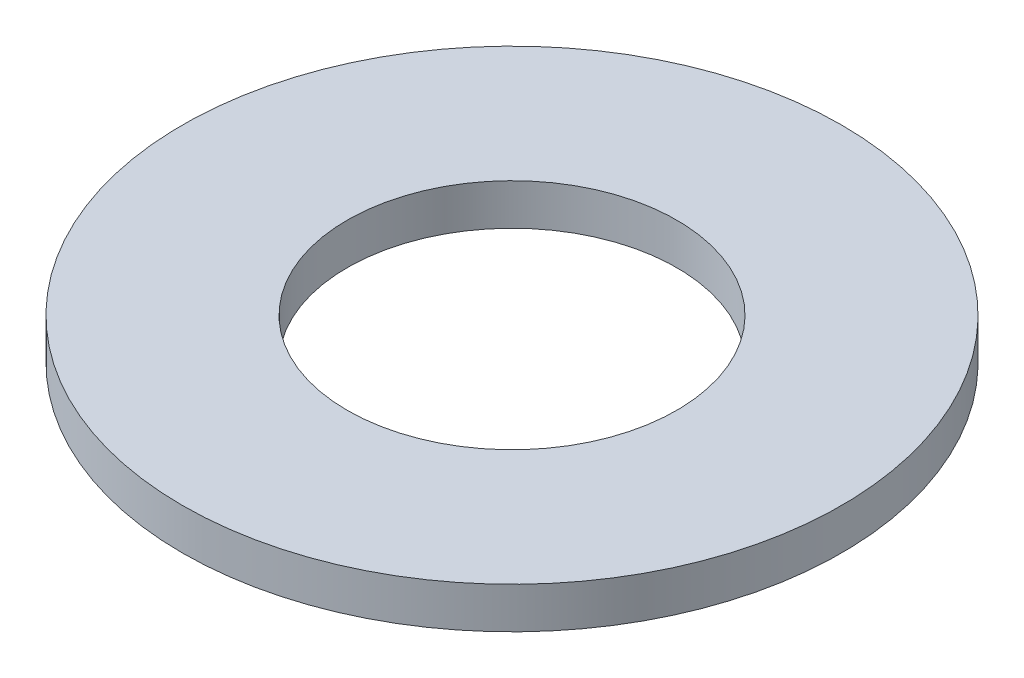
ISO-10303-21;
HEADER;
FILE_DESCRIPTION(('STEP AP214'),'2;1');
FILE_NAME('part.step','',(''),(''),'','','');
FILE_SCHEMA(('AUTOMOTIVE_DESIGN { 1 0 10303 214 1 1 1 1 }'));
ENDSEC;
DATA;
#1=APPLICATION_CONTEXT('core data for automotive mechanical design processes');
#2=APPLICATION_PROTOCOL_DEFINITION('international standard','automotive_design',2000,#1);
#3=PRODUCT_CONTEXT('',#1,'mechanical');
#4=PRODUCT('Part','Part','',(#3));
#5=PRODUCT_RELATED_PRODUCT_CATEGORY('part','',(#4));
#6=PRODUCT_DEFINITION_FORMATION('','',#4);
#7=PRODUCT_DEFINITION_CONTEXT('part definition',#1,'design');
#8=PRODUCT_DEFINITION('design','',#6,#7);
#9=PRODUCT_DEFINITION_SHAPE('','',#8);
#10=(LENGTH_UNIT() NAMED_UNIT(*) SI_UNIT(.MILLI.,.METRE.));
#11=(NAMED_UNIT(*) PLANE_ANGLE_UNIT() SI_UNIT($,.RADIAN.));
#12=(NAMED_UNIT(*) SI_UNIT($,.STERADIAN.) SOLID_ANGLE_UNIT());
#13=UNCERTAINTY_MEASURE_WITH_UNIT(LENGTH_MEASURE(1.E-05),#10,'distance_accuracy_value','');
#14=(GEOMETRIC_REPRESENTATION_CONTEXT(3) GLOBAL_UNCERTAINTY_ASSIGNED_CONTEXT((#13)) GLOBAL_UNIT_ASSIGNED_CONTEXT((#10,
#11,#12)) REPRESENTATION_CONTEXT('',''));
#15=CARTESIAN_POINT('',(0.,0.,0.));
#16=DIRECTION('',(0.,0.,1.));
#17=DIRECTION('',(1.,0.,0.));
#18=AXIS2_PLACEMENT_3D('',#15,#16,#17);
#19=CARTESIAN_POINT('',(0.,0.79375,0.));
#20=DIRECTION('',(0.,-1.,0.));
#21=DIRECTION('',(0.,0.,-1.));
#22=AXIS2_PLACEMENT_3D('',#19,#20,#21);
#23=CYLINDRICAL_SURFACE('',#22,6.35);
#24=CARTESIAN_POINT('',(0.,0.79375,0.));
#25=DIRECTION('',(0.,1.,0.));
#26=DIRECTION('',(0.,0.,1.));
#27=AXIS2_PLACEMENT_3D('',#24,#25,#26);
#28=CIRCLE('',#27,6.35);
#29=CARTESIAN_POINT('',(0.,0.79375,6.35));
#30=VERTEX_POINT('',#29);
#31=EDGE_CURVE('E10',#30,#30,#28,.T.);
#32=ORIENTED_EDGE('',*,*,#31,.F.);
#33=EDGE_LOOP('',(#32));
#34=FACE_BOUND('',#33,.T.);
#35=CARTESIAN_POINT('',(0.,0.,0.));
#36=DIRECTION('',(0.,1.,0.));
#37=DIRECTION('',(0.,0.,1.));
#38=AXIS2_PLACEMENT_3D('',#35,#36,#37);
#39=CIRCLE('',#38,6.35);
#40=CARTESIAN_POINT('',(0.,0.,6.35));
#41=VERTEX_POINT('',#40);
#42=EDGE_CURVE('E39',#41,#41,#39,.T.);
#43=ORIENTED_EDGE('',*,*,#42,.T.);
#44=EDGE_LOOP('',(#43));
#45=FACE_BOUND('',#44,.T.);
#46=ADVANCED_FACE('F32',(#34,#45),#23,.T.);
#47=CARTESIAN_POINT('',(0.,0.79375,0.));
#48=DIRECTION('',(0.,1.,0.));
#49=DIRECTION('',(0.,0.,1.));
#50=AXIS2_PLACEMENT_3D('',#47,#48,#49);
#51=PLANE('',#50);
#52=CARTESIAN_POINT('',(0.,0.79375,0.));
#53=DIRECTION('',(0.,1.,0.));
#54=DIRECTION('',(0.,0.,1.));
#55=AXIS2_PLACEMENT_3D('',#52,#53,#54);
#56=CIRCLE('',#55,3.175);
#57=CARTESIAN_POINT('',(0.,0.79375,3.175));
#58=VERTEX_POINT('',#57);
#59=EDGE_CURVE('E45',#58,#58,#56,.T.);
#60=ORIENTED_EDGE('',*,*,#59,.F.);
#61=EDGE_LOOP('',(#60));
#62=FACE_BOUND('',#61,.T.);
#63=ORIENTED_EDGE('',*,*,#31,.T.);
#64=EDGE_LOOP('',(#63));
#65=FACE_BOUND('',#64,.T.);
#66=ADVANCED_FACE('F61',(#62,#65),#51,.T.);
#67=CARTESIAN_POINT('',(0.,0.,0.));
#68=DIRECTION('',(0.,1.,0.));
#69=DIRECTION('',(0.,0.,1.));
#70=AXIS2_PLACEMENT_3D('',#67,#68,#69);
#71=PLANE('',#70);
#72=CARTESIAN_POINT('',(0.,0.,0.));
#73=DIRECTION('',(0.,1.,0.));
#74=DIRECTION('',(0.,0.,1.));
#75=AXIS2_PLACEMENT_3D('',#72,#73,#74);
#76=CIRCLE('',#75,3.175);
#77=CARTESIAN_POINT('',(0.,0.,3.175));
#78=VERTEX_POINT('',#77);
#79=EDGE_CURVE('E35',#78,#78,#76,.T.);
#80=ORIENTED_EDGE('',*,*,#79,.T.);
#81=EDGE_LOOP('',(#80));
#82=FACE_BOUND('',#81,.T.);
#83=ORIENTED_EDGE('',*,*,#42,.F.);
#84=EDGE_LOOP('',(#83));
#85=FACE_BOUND('',#84,.T.);
#86=ADVANCED_FACE('F52',(#82,#85),#71,.F.);
#87=CARTESIAN_POINT('',(0.,-16.66875,0.));
#88=DIRECTION('',(0.,1.,0.));
#89=DIRECTION('',(0.,0.,1.));
#90=AXIS2_PLACEMENT_3D('',#87,#88,#89);
#91=CYLINDRICAL_SURFACE('',#90,3.175);
#92=ORIENTED_EDGE('',*,*,#59,.T.);
#93=EDGE_LOOP('',(#92));
#94=FACE_BOUND('',#93,.T.);
#95=ORIENTED_EDGE('',*,*,#79,.F.);
#96=EDGE_LOOP('',(#95));
#97=FACE_BOUND('',#96,.T.);
#98=ADVANCED_FACE('F55',(#94,#97),#91,.F.);
#99=CLOSED_SHELL('',(#46,#66,#86,#98));
#100=MANIFOLD_SOLID_BREP('B2',#99);
#101=ADVANCED_BREP_SHAPE_REPRESENTATION('',(#18,#100),#14);
#102=SHAPE_DEFINITION_REPRESENTATION(#9,#101);
ENDSEC;
END-ISO-10303-21;
